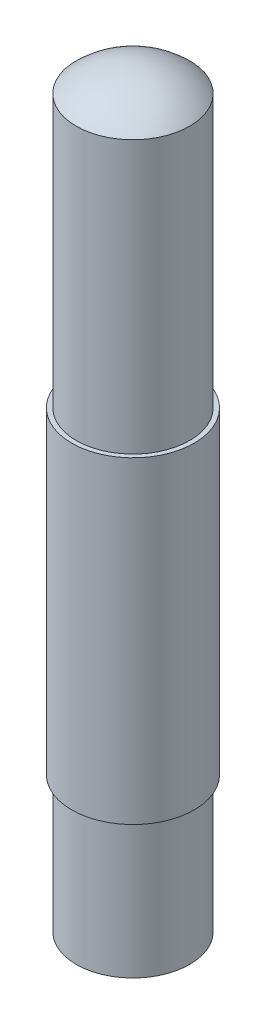
ISO-10303-21;
HEADER;
FILE_DESCRIPTION(('STEP AP214'),'2;1');
FILE_NAME('part.step','',(''),(''),'','','');
FILE_SCHEMA(('AUTOMOTIVE_DESIGN { 1 0 10303 214 1 1 1 1 }'));
ENDSEC;
DATA;
#1=APPLICATION_CONTEXT('core data for automotive mechanical design processes');
#2=APPLICATION_PROTOCOL_DEFINITION('international standard','automotive_design',2000,#1);
#3=PRODUCT_CONTEXT('',#1,'mechanical');
#4=PRODUCT('Part','Part','',(#3));
#5=PRODUCT_RELATED_PRODUCT_CATEGORY('part','',(#4));
#6=PRODUCT_DEFINITION_FORMATION('','',#4);
#7=PRODUCT_DEFINITION_CONTEXT('part definition',#1,'design');
#8=PRODUCT_DEFINITION('design','',#6,#7);
#9=PRODUCT_DEFINITION_SHAPE('','',#8);
#10=(LENGTH_UNIT() NAMED_UNIT(*) SI_UNIT(.MILLI.,.METRE.));
#11=(NAMED_UNIT(*) PLANE_ANGLE_UNIT() SI_UNIT($,.RADIAN.));
#12=(NAMED_UNIT(*) SI_UNIT($,.STERADIAN.) SOLID_ANGLE_UNIT());
#13=UNCERTAINTY_MEASURE_WITH_UNIT(LENGTH_MEASURE(1.E-05),#10,'distance_accuracy_value','');
#14=(GEOMETRIC_REPRESENTATION_CONTEXT(3) GLOBAL_UNCERTAINTY_ASSIGNED_CONTEXT((#13)) GLOBAL_UNIT_ASSIGNED_CONTEXT((#10,
#11,#12)) REPRESENTATION_CONTEXT('',''));
#15=CARTESIAN_POINT('',(0.,0.,0.));
#16=DIRECTION('',(0.,0.,1.));
#17=DIRECTION('',(1.,0.,0.));
#18=AXIS2_PLACEMENT_3D('',#15,#16,#17);
#19=CARTESIAN_POINT('',(0.,0.,0.));
#20=DIRECTION('',(0.,-1.,0.));
#21=DIRECTION('',(0.,0.,-1.));
#22=AXIS2_PLACEMENT_3D('',#19,#20,#21);
#23=PLANE('',#22);
#24=CARTESIAN_POINT('',(0.,0.,0.));
#25=DIRECTION('',(0.,1.,0.));
#26=DIRECTION('',(0.,0.,1.));
#27=AXIS2_PLACEMENT_3D('',#24,#25,#26);
#28=CIRCLE('',#27,12.5);
#29=CARTESIAN_POINT('',(0.,0.,12.5));
#30=VERTEX_POINT('',#29);
#31=EDGE_CURVE('E10',#30,#30,#28,.T.);
#32=ORIENTED_EDGE('',*,*,#31,.F.);
#33=EDGE_LOOP('',(#32));
#34=FACE_BOUND('',#33,.T.);
#35=ADVANCED_FACE('F50',(#34),#23,.T.);
#36=CARTESIAN_POINT('',(0.,160.,0.));
#37=DIRECTION('',(0.,1.,0.));
#38=DIRECTION('',(0.,0.,1.));
#39=AXIS2_PLACEMENT_3D('',#36,#37,#38);
#40=CYLINDRICAL_SURFACE('',#39,12.5);
#41=ORIENTED_EDGE('',*,*,#31,.T.);
#42=EDGE_LOOP('',(#41));
#43=FACE_BOUND('',#42,.T.);
#44=CARTESIAN_POINT('',(0.,30.,0.));
#45=DIRECTION('',(0.,1.,0.));
#46=DIRECTION('',(0.,0.,1.));
#47=AXIS2_PLACEMENT_3D('',#44,#45,#46);
#48=CIRCLE('',#47,12.5);
#49=CARTESIAN_POINT('',(0.,30.,12.5));
#50=VERTEX_POINT('',#49);
#51=EDGE_CURVE('E57',#50,#50,#48,.T.);
#52=ORIENTED_EDGE('',*,*,#51,.F.);
#53=EDGE_LOOP('',(#52));
#54=FACE_BOUND('',#53,.T.);
#55=ADVANCED_FACE('F94',(#43,#54),#40,.T.);
#56=CARTESIAN_POINT('',(-12.5,30.,0.));
#57=DIRECTION('',(0.,-1.,0.));
#58=DIRECTION('',(0.,0.,-1.));
#59=AXIS2_PLACEMENT_3D('',#56,#57,#58);
#60=PLANE('',#59);
#61=ORIENTED_EDGE('',*,*,#51,.T.);
#62=EDGE_LOOP('',(#61));
#63=FACE_BOUND('',#62,.T.);
#64=CARTESIAN_POINT('',(0.,30.,0.));
#65=DIRECTION('',(0.,1.,0.));
#66=DIRECTION('',(0.,0.,1.));
#67=AXIS2_PLACEMENT_3D('',#64,#65,#66);
#68=CIRCLE('',#67,13.5);
#69=CARTESIAN_POINT('',(0.,30.,13.5));
#70=VERTEX_POINT('',#69);
#71=EDGE_CURVE('E62',#70,#70,#68,.T.);
#72=ORIENTED_EDGE('',*,*,#71,.F.);
#73=EDGE_LOOP('',(#72));
#74=FACE_BOUND('',#73,.T.);
#75=ADVANCED_FACE('F97',(#63,#74),#60,.T.);
#76=CARTESIAN_POINT('',(0.,160.,0.));
#77=DIRECTION('',(0.,1.,0.));
#78=DIRECTION('',(0.,0.,1.));
#79=AXIS2_PLACEMENT_3D('',#76,#77,#78);
#80=CYLINDRICAL_SURFACE('',#79,13.5);
#81=ORIENTED_EDGE('',*,*,#71,.T.);
#82=EDGE_LOOP('',(#81));
#83=FACE_BOUND('',#82,.T.);
#84=CARTESIAN_POINT('',(0.,100.,0.));
#85=DIRECTION('',(0.,1.,0.));
#86=DIRECTION('',(0.,0.,1.));
#87=AXIS2_PLACEMENT_3D('',#84,#85,#86);
#88=CIRCLE('',#87,13.5);
#89=CARTESIAN_POINT('',(0.,100.,13.5));
#90=VERTEX_POINT('',#89);
#91=EDGE_CURVE('E70',#90,#90,#88,.T.);
#92=ORIENTED_EDGE('',*,*,#91,.F.);
#93=EDGE_LOOP('',(#92));
#94=FACE_BOUND('',#93,.T.);
#95=ADVANCED_FACE('F89',(#83,#94),#80,.T.);
#96=CARTESIAN_POINT('',(-13.5,100.,0.));
#97=DIRECTION('',(0.,1.,0.));
#98=DIRECTION('',(0.,0.,1.));
#99=AXIS2_PLACEMENT_3D('',#96,#97,#98);
#100=PLANE('',#99);
#101=ORIENTED_EDGE('',*,*,#91,.T.);
#102=EDGE_LOOP('',(#101));
#103=FACE_BOUND('',#102,.T.);
#104=CARTESIAN_POINT('',(0.,100.,0.));
#105=DIRECTION('',(0.,1.,0.));
#106=DIRECTION('',(0.,0.,1.));
#107=AXIS2_PLACEMENT_3D('',#104,#105,#106);
#108=CIRCLE('',#107,12.5);
#109=CARTESIAN_POINT('',(0.,100.,12.5));
#110=VERTEX_POINT('',#109);
#111=EDGE_CURVE('E72',#110,#110,#108,.T.);
#112=ORIENTED_EDGE('',*,*,#111,.F.);
#113=EDGE_LOOP('',(#112));
#114=FACE_BOUND('',#113,.T.);
#115=ADVANCED_FACE('F82',(#103,#114),#100,.T.);
#116=CARTESIAN_POINT('',(0.,160.,0.));
#117=DIRECTION('',(0.,1.,0.));
#118=DIRECTION('',(0.,0.,1.));
#119=AXIS2_PLACEMENT_3D('',#116,#117,#118);
#120=CYLINDRICAL_SURFACE('',#119,12.5);
#121=ORIENTED_EDGE('',*,*,#111,.T.);
#122=EDGE_LOOP('',(#121));
#123=FACE_BOUND('',#122,.T.);
#124=CARTESIAN_POINT('',(0.,160.,0.));
#125=DIRECTION('',(0.,1.,0.));
#126=DIRECTION('',(0.,0.,1.));
#127=AXIS2_PLACEMENT_3D('',#124,#125,#126);
#128=CIRCLE('',#127,12.5);
#129=CARTESIAN_POINT('',(0.,160.,12.5));
#130=VERTEX_POINT('',#129);
#131=EDGE_CURVE('E51',#130,#130,#128,.T.);
#132=ORIENTED_EDGE('',*,*,#131,.F.);
#133=EDGE_LOOP('',(#132));
#134=FACE_BOUND('',#133,.T.);
#135=ADVANCED_FACE('F81',(#123,#134),#120,.T.);
#136=CARTESIAN_POINT('',(0.,146.875,0.));
#137=DIRECTION('',(0.,0.,1.));
#138=DIRECTION('',(1.,0.,0.));
#139=AXIS2_PLACEMENT_3D('',#136,#137,#138);
#140=SPHERICAL_SURFACE('',#139,18.125);
#141=CARTESIAN_POINT('',(0.,146.875,0.));
#142=DIRECTION('',(0.,1.,0.));
#143=DIRECTION('',(0.,0.,1.));
#144=AXIS2_PLACEMENT_3D('',#141,#142,#143);
#145=SPHERICAL_SURFACE('',#144,18.125);
#146=ORIENTED_EDGE('',*,*,#131,.T.);
#147=EDGE_LOOP('',(#146));
#148=FACE_BOUND('',#147,.T.);
#149=ADVANCED_FACE('F47',(#148),#145,.T.);
#150=CLOSED_SHELL('',(#35,#55,#75,#95,#115,#135,#149));
#151=MANIFOLD_SOLID_BREP('B2',#150);
#152=ADVANCED_BREP_SHAPE_REPRESENTATION('',(#18,#151),#14);
#153=SHAPE_DEFINITION_REPRESENTATION(#9,#152);
ENDSEC;
END-ISO-10303-21;
